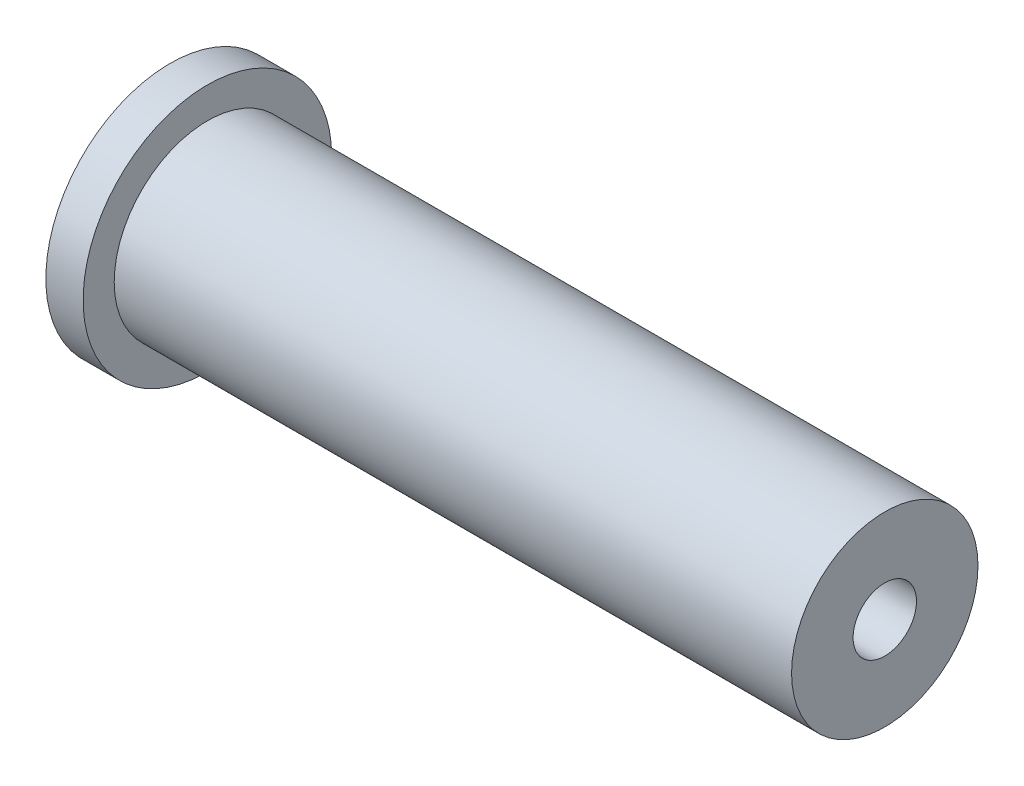
ISO-10303-21;
HEADER;
FILE_DESCRIPTION(('STEP AP214'),'2;1');
FILE_NAME('part.step','',(''),(''),'','','');
FILE_SCHEMA(('AUTOMOTIVE_DESIGN { 1 0 10303 214 1 1 1 1 }'));
ENDSEC;
DATA;
#1=APPLICATION_CONTEXT('core data for automotive mechanical design processes');
#2=APPLICATION_PROTOCOL_DEFINITION('international standard','automotive_design',2000,#1);
#3=PRODUCT_CONTEXT('',#1,'mechanical');
#4=PRODUCT('Part','Part','',(#3));
#5=PRODUCT_RELATED_PRODUCT_CATEGORY('part','',(#4));
#6=PRODUCT_DEFINITION_FORMATION('','',#4);
#7=PRODUCT_DEFINITION_CONTEXT('part definition',#1,'design');
#8=PRODUCT_DEFINITION('design','',#6,#7);
#9=PRODUCT_DEFINITION_SHAPE('','',#8);
#10=(LENGTH_UNIT() NAMED_UNIT(*) SI_UNIT(.MILLI.,.METRE.));
#11=(NAMED_UNIT(*) PLANE_ANGLE_UNIT() SI_UNIT($,.RADIAN.));
#12=(NAMED_UNIT(*) SI_UNIT($,.STERADIAN.) SOLID_ANGLE_UNIT());
#13=UNCERTAINTY_MEASURE_WITH_UNIT(LENGTH_MEASURE(1.E-05),#10,'distance_accuracy_value','');
#14=(GEOMETRIC_REPRESENTATION_CONTEXT(3) GLOBAL_UNCERTAINTY_ASSIGNED_CONTEXT((#13)) GLOBAL_UNIT_ASSIGNED_CONTEXT((#10,
#11,#12)) REPRESENTATION_CONTEXT('',''));
#15=CARTESIAN_POINT('',(0.,0.,0.));
#16=DIRECTION('',(0.,0.,1.));
#17=DIRECTION('',(1.,0.,0.));
#18=AXIS2_PLACEMENT_3D('',#15,#16,#17);
#19=CARTESIAN_POINT('',(0.,0.,0.));
#20=DIRECTION('',(-1.,0.,0.));
#21=DIRECTION('',(0.,0.,1.));
#22=AXIS2_PLACEMENT_3D('',#19,#20,#21);
#23=PLANE('',#22);
#24=CARTESIAN_POINT('',(0.,0.,0.));
#25=DIRECTION('',(1.,0.,0.));
#26=DIRECTION('',(0.,0.,-1.));
#27=AXIS2_PLACEMENT_3D('',#24,#25,#26);
#28=CIRCLE('',#27,10.);
#29=CARTESIAN_POINT('',(0.,0.,-10.));
#30=VERTEX_POINT('',#29);
#31=EDGE_CURVE('E10',#30,#30,#28,.T.);
#32=ORIENTED_EDGE('',*,*,#31,.F.);
#33=EDGE_LOOP('',(#32));
#34=FACE_BOUND('',#33,.T.);
#35=ADVANCED_FACE('F37',(#34),#23,.T.);
#36=CARTESIAN_POINT('',(0.,0.,0.));
#37=DIRECTION('',(1.,0.,0.));
#38=DIRECTION('',(0.,0.,-1.));
#39=AXIS2_PLACEMENT_3D('',#36,#37,#38);
#40=CYLINDRICAL_SURFACE('',#39,10.);
#41=ORIENTED_EDGE('',*,*,#31,.T.);
#42=EDGE_LOOP('',(#41));
#43=FACE_BOUND('',#42,.T.);
#44=CARTESIAN_POINT('',(3.,0.,0.));
#45=DIRECTION('',(1.,0.,0.));
#46=DIRECTION('',(0.,0.,-1.));
#47=AXIS2_PLACEMENT_3D('',#44,#45,#46);
#48=CIRCLE('',#47,10.);
#49=CARTESIAN_POINT('',(3.,0.,-10.));
#50=VERTEX_POINT('',#49);
#51=EDGE_CURVE('E43',#50,#50,#48,.T.);
#52=ORIENTED_EDGE('',*,*,#51,.F.);
#53=EDGE_LOOP('',(#52));
#54=FACE_BOUND('',#53,.T.);
#55=ADVANCED_FACE('F85',(#43,#54),#40,.T.);
#56=CARTESIAN_POINT('',(3.,10.,0.));
#57=DIRECTION('',(1.,0.,0.));
#58=DIRECTION('',(0.,0.,-1.));
#59=AXIS2_PLACEMENT_3D('',#56,#57,#58);
#60=PLANE('',#59);
#61=ORIENTED_EDGE('',*,*,#51,.T.);
#62=EDGE_LOOP('',(#61));
#63=FACE_BOUND('',#62,.T.);
#64=CARTESIAN_POINT('',(3.,0.,0.));
#65=DIRECTION('',(1.,0.,0.));
#66=DIRECTION('',(0.,0.,-1.));
#67=AXIS2_PLACEMENT_3D('',#64,#65,#66);
#68=CIRCLE('',#67,7.5);
#69=CARTESIAN_POINT('',(3.,0.,-7.5));
#70=VERTEX_POINT('',#69);
#71=EDGE_CURVE('E47',#70,#70,#68,.T.);
#72=ORIENTED_EDGE('',*,*,#71,.F.);
#73=EDGE_LOOP('',(#72));
#74=FACE_BOUND('',#73,.T.);
#75=ADVANCED_FACE('F79',(#63,#74),#60,.T.);
#76=CARTESIAN_POINT('',(0.,0.,0.));
#77=DIRECTION('',(1.,0.,0.));
#78=DIRECTION('',(0.,0.,-1.));
#79=AXIS2_PLACEMENT_3D('',#76,#77,#78);
#80=CYLINDRICAL_SURFACE('',#79,7.5);
#81=ORIENTED_EDGE('',*,*,#71,.T.);
#82=EDGE_LOOP('',(#81));
#83=FACE_BOUND('',#82,.T.);
#84=CARTESIAN_POINT('',(57.5,0.,0.));
#85=DIRECTION('',(1.,0.,0.));
#86=DIRECTION('',(0.,0.,-1.));
#87=AXIS2_PLACEMENT_3D('',#84,#85,#86);
#88=CIRCLE('',#87,7.5);
#89=CARTESIAN_POINT('',(57.5,0.,-7.5));
#90=VERTEX_POINT('',#89);
#91=EDGE_CURVE('E51',#90,#90,#88,.T.);
#92=ORIENTED_EDGE('',*,*,#91,.F.);
#93=EDGE_LOOP('',(#92));
#94=FACE_BOUND('',#93,.T.);
#95=ADVANCED_FACE('F74',(#83,#94),#80,.T.);
#96=CARTESIAN_POINT('',(57.5,7.5,0.));
#97=DIRECTION('',(1.,0.,0.));
#98=DIRECTION('',(0.,0.,-1.));
#99=AXIS2_PLACEMENT_3D('',#96,#97,#98);
#100=PLANE('',#99);
#101=CARTESIAN_POINT('',(57.5,0.,0.));
#102=DIRECTION('',(1.,0.,0.));
#103=DIRECTION('',(0.,0.,-1.));
#104=AXIS2_PLACEMENT_3D('',#101,#102,#103);
#105=CIRCLE('',#104,2.55);
#106=CARTESIAN_POINT('',(57.5,0.,-2.55));
#107=VERTEX_POINT('',#106);
#108=EDGE_CURVE('E57',#107,#107,#105,.T.);
#109=ORIENTED_EDGE('',*,*,#108,.F.);
#110=EDGE_LOOP('',(#109));
#111=FACE_BOUND('',#110,.T.);
#112=ORIENTED_EDGE('',*,*,#91,.T.);
#113=EDGE_LOOP('',(#112));
#114=FACE_BOUND('',#113,.T.);
#115=ADVANCED_FACE('F68',(#111,#114),#100,.T.);
#116=CARTESIAN_POINT('',(47.5,0.,0.));
#117=DIRECTION('',(1.,0.,0.));
#118=DIRECTION('',(0.,0.,-1.));
#119=AXIS2_PLACEMENT_3D('',#116,#117,#118);
#120=CYLINDRICAL_SURFACE('',#119,2.55);
#121=CARTESIAN_POINT('',(47.5,0.,0.));
#122=DIRECTION('',(1.,0.,0.));
#123=DIRECTION('',(0.,0.,-1.));
#124=AXIS2_PLACEMENT_3D('',#121,#122,#123);
#125=CIRCLE('',#124,2.55);
#126=CARTESIAN_POINT('',(47.5,0.,-2.55));
#127=VERTEX_POINT('',#126);
#128=EDGE_CURVE('E56',#127,#127,#125,.T.);
#129=ORIENTED_EDGE('',*,*,#128,.F.);
#130=EDGE_LOOP('',(#129));
#131=FACE_BOUND('',#130,.T.);
#132=ORIENTED_EDGE('',*,*,#108,.T.);
#133=EDGE_LOOP('',(#132));
#134=FACE_BOUND('',#133,.T.);
#135=ADVANCED_FACE('F65',(#131,#134),#120,.F.);
#136=CARTESIAN_POINT('',(47.5,0.,0.));
#137=DIRECTION('',(1.,0.,0.));
#138=DIRECTION('',(0.,0.,-1.));
#139=AXIS2_PLACEMENT_3D('',#136,#137,#138);
#140=PLANE('',#139);
#141=ORIENTED_EDGE('',*,*,#128,.T.);
#142=EDGE_LOOP('',(#141));
#143=FACE_BOUND('',#142,.T.);
#144=ADVANCED_FACE('F63',(#143),#140,.T.);
#145=CLOSED_SHELL('',(#35,#55,#75,#95,#115,#135,#144));
#146=MANIFOLD_SOLID_BREP('B2',#145);
#147=ADVANCED_BREP_SHAPE_REPRESENTATION('',(#18,#146),#14);
#148=SHAPE_DEFINITION_REPRESENTATION(#9,#147);
ENDSEC;
END-ISO-10303-21;
